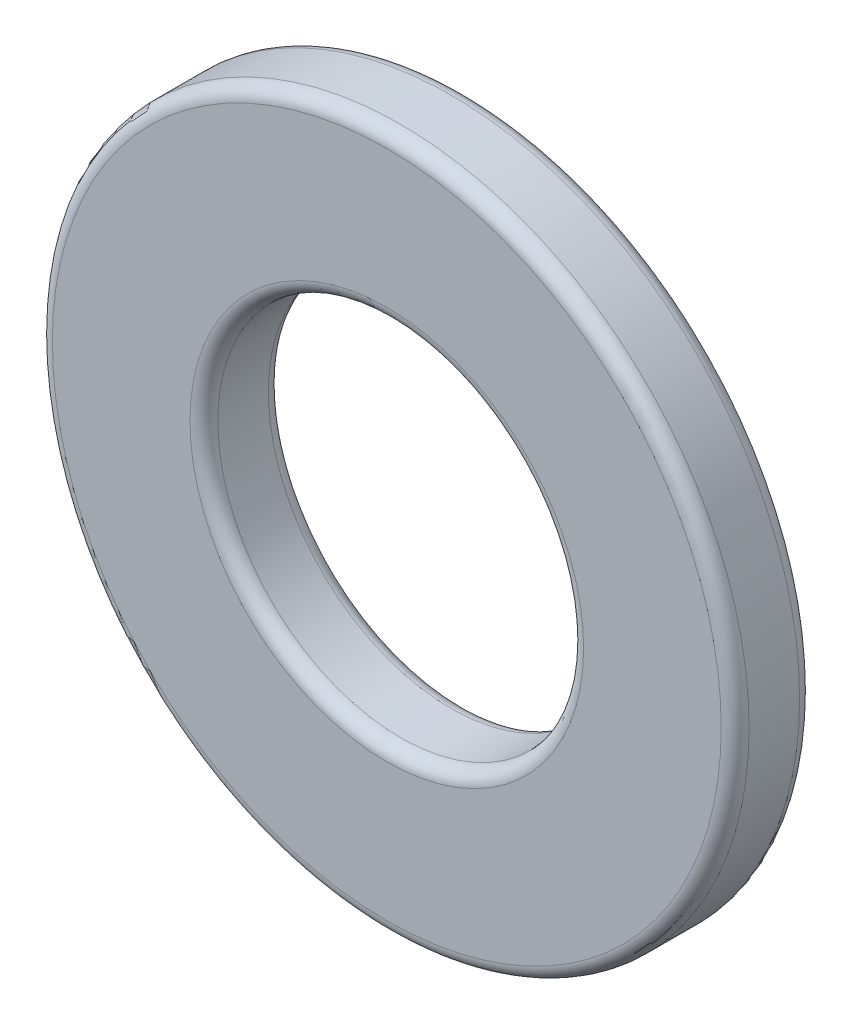
ISO-10303-21;
HEADER;
FILE_DESCRIPTION(('STEP AP214'),'2;1');
FILE_NAME('part.step','',(''),(''),'','','');
FILE_SCHEMA(('AUTOMOTIVE_DESIGN { 1 0 10303 214 1 1 1 1 }'));
ENDSEC;
DATA;
#1=APPLICATION_CONTEXT('core data for automotive mechanical design processes');
#2=APPLICATION_PROTOCOL_DEFINITION('international standard','automotive_design',2000,#1);
#3=PRODUCT_CONTEXT('',#1,'mechanical');
#4=PRODUCT('Part','Part','',(#3));
#5=PRODUCT_RELATED_PRODUCT_CATEGORY('part','',(#4));
#6=PRODUCT_DEFINITION_FORMATION('','',#4);
#7=PRODUCT_DEFINITION_CONTEXT('part definition',#1,'design');
#8=PRODUCT_DEFINITION('design','',#6,#7);
#9=PRODUCT_DEFINITION_SHAPE('','',#8);
#10=(LENGTH_UNIT() NAMED_UNIT(*) SI_UNIT(.MILLI.,.METRE.));
#11=(NAMED_UNIT(*) PLANE_ANGLE_UNIT() SI_UNIT($,.RADIAN.));
#12=(NAMED_UNIT(*) SI_UNIT($,.STERADIAN.) SOLID_ANGLE_UNIT());
#13=UNCERTAINTY_MEASURE_WITH_UNIT(LENGTH_MEASURE(1.E-05),#10,'distance_accuracy_value','');
#14=(GEOMETRIC_REPRESENTATION_CONTEXT(3) GLOBAL_UNCERTAINTY_ASSIGNED_CONTEXT((#13)) GLOBAL_UNIT_ASSIGNED_CONTEXT((#10,
#11,#12)) REPRESENTATION_CONTEXT('',''));
#15=CARTESIAN_POINT('',(0.,0.,0.));
#16=DIRECTION('',(0.,0.,1.));
#17=DIRECTION('',(1.,0.,0.));
#18=AXIS2_PLACEMENT_3D('',#15,#16,#17);
#19=CARTESIAN_POINT('',(0.,0.,-0.9));
#20=DIRECTION('',(0.,0.,1.));
#21=DIRECTION('',(1.,0.,0.));
#22=AXIS2_PLACEMENT_3D('',#19,#20,#21);
#23=CYLINDRICAL_SURFACE('',#22,8.);
#24=CARTESIAN_POINT('',(0.,0.,-0.58));
#25=DIRECTION('',(0.,0.,1.));
#26=DIRECTION('',(1.,0.,0.));
#27=AXIS2_PLACEMENT_3D('',#24,#25,#26);
#28=CIRCLE('',#27,8.);
#29=CARTESIAN_POINT('',(8.,0.,-0.58));
#30=VERTEX_POINT('',#29);
#31=EDGE_CURVE('E119',#30,#30,#28,.T.);
#32=ORIENTED_EDGE('',*,*,#31,.T.);
#33=EDGE_LOOP('',(#32));
#34=FACE_BOUND('',#33,.T.);
#35=CARTESIAN_POINT('',(0.,0.,0.58));
#36=DIRECTION('',(0.,0.,1.));
#37=DIRECTION('',(1.,0.,0.));
#38=AXIS2_PLACEMENT_3D('',#35,#36,#37);
#39=CIRCLE('',#38,8.);
#40=CARTESIAN_POINT('',(8.,0.,0.58));
#41=VERTEX_POINT('',#40);
#42=EDGE_CURVE('E123',#41,#41,#39,.F.);
#43=ORIENTED_EDGE('',*,*,#42,.T.);
#44=EDGE_LOOP('',(#43));
#45=FACE_BOUND('',#44,.T.);
#46=ADVANCED_FACE('F85',(#34,#45),#23,.T.);
#47=CARTESIAN_POINT('',(0.,0.,-0.9));
#48=DIRECTION('',(0.,0.,1.));
#49=DIRECTION('',(1.,0.,0.));
#50=AXIS2_PLACEMENT_3D('',#47,#48,#49);
#51=PLANE('',#50);
#52=CARTESIAN_POINT('',(0.,0.,-0.9));
#53=DIRECTION('',(0.,0.,1.));
#54=DIRECTION('',(1.,0.,0.));
#55=AXIS2_PLACEMENT_3D('',#52,#53,#54);
#56=CIRCLE('',#55,7.68);
#57=CARTESIAN_POINT('',(7.68,0.,-0.9));
#58=VERTEX_POINT('',#57);
#59=EDGE_CURVE('E111',#58,#58,#56,.F.);
#60=ORIENTED_EDGE('',*,*,#59,.T.);
#61=EDGE_LOOP('',(#60));
#62=FACE_BOUND('',#61,.T.);
#63=CARTESIAN_POINT('',(0.,0.,-0.9));
#64=DIRECTION('',(0.,0.,1.));
#65=DIRECTION('',(1.,0.,0.));
#66=AXIS2_PLACEMENT_3D('',#63,#64,#65);
#67=CIRCLE('',#66,4.52);
#68=CARTESIAN_POINT('',(4.52,0.,-0.9));
#69=VERTEX_POINT('',#68);
#70=EDGE_CURVE('E115',#69,#69,#67,.T.);
#71=ORIENTED_EDGE('',*,*,#70,.T.);
#72=EDGE_LOOP('',(#71));
#73=FACE_BOUND('',#72,.T.);
#74=ADVANCED_FACE('F139',(#62,#73),#51,.F.);
#75=CARTESIAN_POINT('',(0.,0.,-0.9));
#76=DIRECTION('',(0.,0.,1.));
#77=DIRECTION('',(1.,0.,0.));
#78=AXIS2_PLACEMENT_3D('',#75,#76,#77);
#79=CYLINDRICAL_SURFACE('',#78,4.2);
#80=CARTESIAN_POINT('',(0.,0.,-0.58));
#81=DIRECTION('',(0.,0.,1.));
#82=DIRECTION('',(1.,0.,0.));
#83=AXIS2_PLACEMENT_3D('',#80,#81,#82);
#84=CIRCLE('',#83,4.2);
#85=CARTESIAN_POINT('',(4.2,0.,-0.58));
#86=VERTEX_POINT('',#85);
#87=EDGE_CURVE('E99',#86,#86,#84,.F.);
#88=ORIENTED_EDGE('',*,*,#87,.T.);
#89=EDGE_LOOP('',(#88));
#90=FACE_BOUND('',#89,.T.);
#91=CARTESIAN_POINT('',(0.,0.,0.58));
#92=DIRECTION('',(0.,0.,1.));
#93=DIRECTION('',(1.,0.,0.));
#94=AXIS2_PLACEMENT_3D('',#91,#92,#93);
#95=CIRCLE('',#94,4.2);
#96=CARTESIAN_POINT('',(4.2,0.,0.58));
#97=VERTEX_POINT('',#96);
#98=EDGE_CURVE('E105',#97,#97,#95,.T.);
#99=ORIENTED_EDGE('',*,*,#98,.T.);
#100=EDGE_LOOP('',(#99));
#101=FACE_BOUND('',#100,.T.);
#102=ADVANCED_FACE('F145',(#90,#101),#79,.F.);
#103=CARTESIAN_POINT('',(0.,0.,0.9));
#104=DIRECTION('',(0.,0.,1.));
#105=DIRECTION('',(1.,0.,0.));
#106=AXIS2_PLACEMENT_3D('',#103,#104,#105);
#107=PLANE('',#106);
#108=CARTESIAN_POINT('',(0.,0.,0.9));
#109=DIRECTION('',(0.,0.,1.));
#110=DIRECTION('',(1.,0.,0.));
#111=AXIS2_PLACEMENT_3D('',#108,#109,#110);
#112=CIRCLE('',#111,4.52);
#113=CARTESIAN_POINT('',(4.52,0.,0.9));
#114=VERTEX_POINT('',#113);
#115=EDGE_CURVE('E11',#114,#114,#112,.F.);
#116=ORIENTED_EDGE('',*,*,#115,.T.);
#117=EDGE_LOOP('',(#116));
#118=FACE_BOUND('',#117,.T.);
#119=CARTESIAN_POINT('',(0.,0.,0.9));
#120=DIRECTION('',(0.,0.,1.));
#121=DIRECTION('',(1.,0.,0.));
#122=AXIS2_PLACEMENT_3D('',#119,#120,#121);
#123=CIRCLE('',#122,7.68);
#124=CARTESIAN_POINT('',(7.68,0.,0.9));
#125=VERTEX_POINT('',#124);
#126=EDGE_CURVE('E93',#125,#125,#123,.T.);
#127=ORIENTED_EDGE('',*,*,#126,.T.);
#128=EDGE_LOOP('',(#127));
#129=FACE_BOUND('',#128,.T.);
#130=ADVANCED_FACE('F153',(#118,#129),#107,.T.);
#131=CARTESIAN_POINT('',(0.,0.,-0.58));
#132=DIRECTION('',(0.,0.,1.));
#133=DIRECTION('',(1.,0.,0.));
#134=AXIS2_PLACEMENT_3D('',#131,#132,#133);
#135=TOROIDAL_SURFACE('',#134,7.68,0.32);
#136=ORIENTED_EDGE('',*,*,#59,.F.);
#137=EDGE_LOOP('',(#136));
#138=FACE_BOUND('',#137,.T.);
#139=ORIENTED_EDGE('',*,*,#31,.F.);
#140=EDGE_LOOP('',(#139));
#141=FACE_BOUND('',#140,.T.);
#142=ADVANCED_FACE('F150',(#138,#141),#135,.T.);
#143=CARTESIAN_POINT('',(0.,0.,-0.58));
#144=DIRECTION('',(0.,0.,1.));
#145=DIRECTION('',(1.,0.,0.));
#146=AXIS2_PLACEMENT_3D('',#143,#144,#145);
#147=TOROIDAL_SURFACE('',#146,4.52,0.32);
#148=ORIENTED_EDGE('',*,*,#87,.F.);
#149=EDGE_LOOP('',(#148));
#150=FACE_BOUND('',#149,.T.);
#151=ORIENTED_EDGE('',*,*,#70,.F.);
#152=EDGE_LOOP('',(#151));
#153=FACE_BOUND('',#152,.T.);
#154=ADVANCED_FACE('F136',(#150,#153),#147,.T.);
#155=CARTESIAN_POINT('',(0.,0.,0.58));
#156=DIRECTION('',(0.,0.,1.));
#157=DIRECTION('',(1.,0.,0.));
#158=AXIS2_PLACEMENT_3D('',#155,#156,#157);
#159=TOROIDAL_SURFACE('',#158,4.52,0.32);
#160=ORIENTED_EDGE('',*,*,#115,.F.);
#161=EDGE_LOOP('',(#160));
#162=FACE_BOUND('',#161,.T.);
#163=ORIENTED_EDGE('',*,*,#98,.F.);
#164=EDGE_LOOP('',(#163));
#165=FACE_BOUND('',#164,.T.);
#166=ADVANCED_FACE('F132',(#162,#165),#159,.T.);
#167=CARTESIAN_POINT('',(0.,0.,0.58));
#168=DIRECTION('',(0.,0.,1.));
#169=DIRECTION('',(1.,0.,0.));
#170=AXIS2_PLACEMENT_3D('',#167,#168,#169);
#171=TOROIDAL_SURFACE('',#170,7.68,0.32);
#172=ORIENTED_EDGE('',*,*,#42,.F.);
#173=EDGE_LOOP('',(#172));
#174=FACE_BOUND('',#173,.T.);
#175=ORIENTED_EDGE('',*,*,#126,.F.);
#176=EDGE_LOOP('',(#175));
#177=FACE_BOUND('',#176,.T.);
#178=ADVANCED_FACE('F87',(#174,#177),#171,.T.);
#179=CLOSED_SHELL('',(#46,#74,#102,#130,#142,#154,#166,#178));
#180=MANIFOLD_SOLID_BREP('B2',#179);
#181=ADVANCED_BREP_SHAPE_REPRESENTATION('',(#18,#180),#14);
#182=SHAPE_DEFINITION_REPRESENTATION(#9,#181);
ENDSEC;
END-ISO-10303-21;
